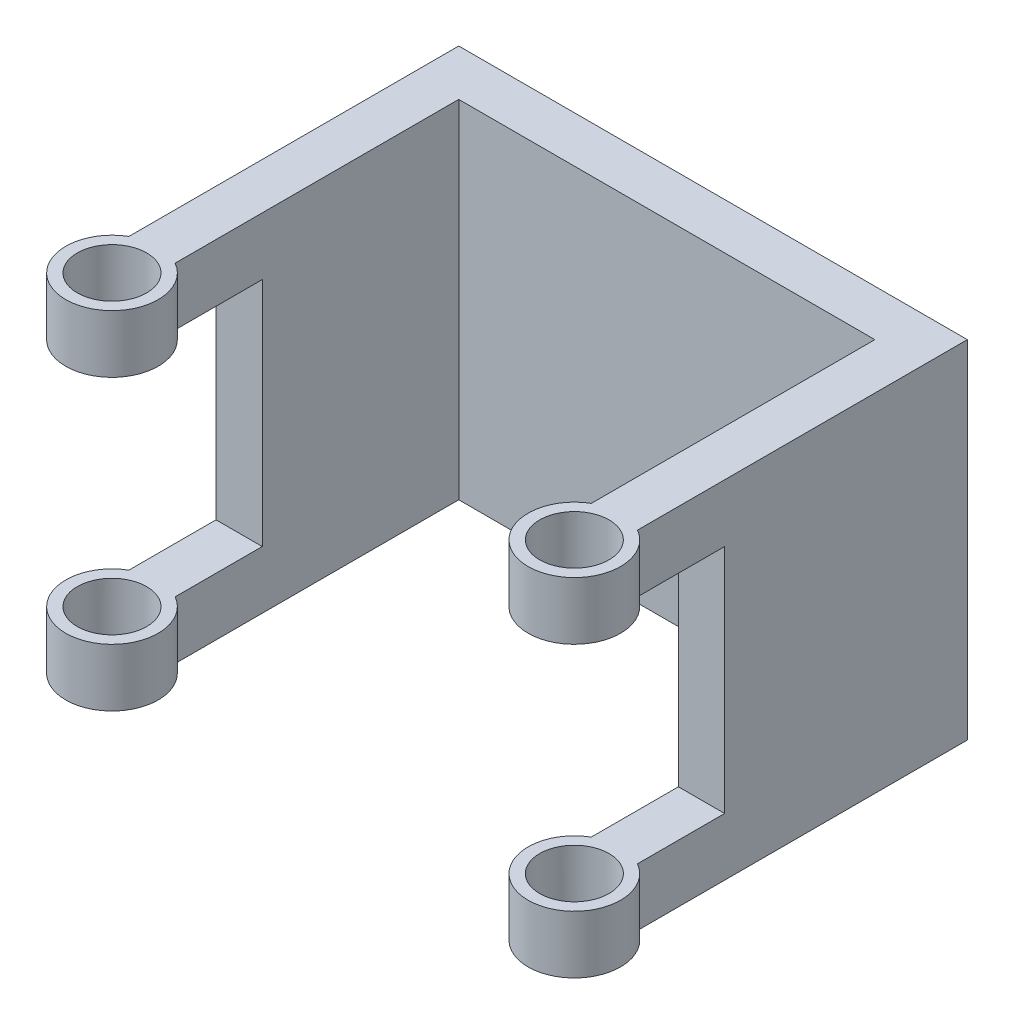
ISO-10303-21;
HEADER;
FILE_DESCRIPTION(('STEP AP214'),'2;1');
FILE_NAME('part.step','',(''),(''),'','','');
FILE_SCHEMA(('AUTOMOTIVE_DESIGN { 1 0 10303 214 1 1 1 1 }'));
ENDSEC;
DATA;
#1=APPLICATION_CONTEXT('core data for automotive mechanical design processes');
#2=APPLICATION_PROTOCOL_DEFINITION('international standard','automotive_design',2000,#1);
#3=PRODUCT_CONTEXT('',#1,'mechanical');
#4=PRODUCT('Part','Part','',(#3));
#5=PRODUCT_RELATED_PRODUCT_CATEGORY('part','',(#4));
#6=PRODUCT_DEFINITION_FORMATION('','',#4);
#7=PRODUCT_DEFINITION_CONTEXT('part definition',#1,'design');
#8=PRODUCT_DEFINITION('design','',#6,#7);
#9=PRODUCT_DEFINITION_SHAPE('','',#8);
#10=(LENGTH_UNIT() NAMED_UNIT(*) SI_UNIT(.MILLI.,.METRE.));
#11=(NAMED_UNIT(*) PLANE_ANGLE_UNIT() SI_UNIT($,.RADIAN.));
#12=(NAMED_UNIT(*) SI_UNIT($,.STERADIAN.) SOLID_ANGLE_UNIT());
#13=UNCERTAINTY_MEASURE_WITH_UNIT(LENGTH_MEASURE(1.E-05),#10,'distance_accuracy_value','');
#14=(GEOMETRIC_REPRESENTATION_CONTEXT(3) GLOBAL_UNCERTAINTY_ASSIGNED_CONTEXT((#13)) GLOBAL_UNIT_ASSIGNED_CONTEXT((#10,
#11,#12)) REPRESENTATION_CONTEXT('',''));
#15=CARTESIAN_POINT('',(0.,0.,0.));
#16=DIRECTION('',(0.,0.,1.));
#17=DIRECTION('',(1.,0.,0.));
#18=AXIS2_PLACEMENT_3D('',#15,#16,#17);
#19=CARTESIAN_POINT('',(20.,15.,0.));
#20=DIRECTION('',(0.,-1.,0.));
#21=DIRECTION('',(0.,0.,-1.));
#22=AXIS2_PLACEMENT_3D('',#19,#20,#21);
#23=CYLINDRICAL_SURFACE('',#22,2.);
#24=DIRECTION('',(0.,-1.,0.));
#25=VECTOR('',#24,1.);
#26=CARTESIAN_POINT('',(21.,15.,-1.73205080756888));
#27=LINE('',#26,#25);
#28=CARTESIAN_POINT('',(21.,2.5,-1.73205080756888));
#29=VERTEX_POINT('',#28);
#30=CARTESIAN_POINT('',(21.,0.,-1.73205080756888));
#31=VERTEX_POINT('',#30);
#32=EDGE_CURVE('E271',#29,#31,#27,.T.);
#33=ORIENTED_EDGE('',*,*,#32,.F.);
#34=CARTESIAN_POINT('',(20.,2.5,0.));
#35=DIRECTION('',(0.,-1.,0.));
#36=DIRECTION('',(0.,0.,-1.));
#37=AXIS2_PLACEMENT_3D('',#34,#35,#36);
#38=CIRCLE('',#37,2.);
#39=CARTESIAN_POINT('',(19.,2.5,-1.73205080756888));
#40=VERTEX_POINT('',#39);
#41=EDGE_CURVE('E189',#29,#40,#38,.T.);
#42=ORIENTED_EDGE('',*,*,#41,.T.);
#43=DIRECTION('',(0.,-1.,0.));
#44=VECTOR('',#43,1.);
#45=CARTESIAN_POINT('',(19.,15.,-1.73205080756888));
#46=LINE('',#45,#44);
#47=CARTESIAN_POINT('',(19.,0.,-1.73205080756888));
#48=VERTEX_POINT('',#47);
#49=EDGE_CURVE('E276',#40,#48,#46,.T.);
#50=ORIENTED_EDGE('',*,*,#49,.T.);
#51=CARTESIAN_POINT('',(20.,0.,0.));
#52=DIRECTION('',(0.,1.,0.));
#53=DIRECTION('',(0.,0.,1.));
#54=AXIS2_PLACEMENT_3D('',#51,#52,#53);
#55=CIRCLE('',#54,2.);
#56=EDGE_CURVE('E231',#48,#31,#55,.T.);
#57=ORIENTED_EDGE('',*,*,#56,.T.);
#58=EDGE_LOOP('',(#33,#42,#50,#57));
#59=FACE_BOUND('',#58,.T.);
#60=ADVANCED_FACE('F39',(#59),#23,.T.);
#61=CARTESIAN_POINT('',(0.,15.,0.));
#62=DIRECTION('',(0.,-1.,0.));
#63=DIRECTION('',(0.,0.,-1.));
#64=AXIS2_PLACEMENT_3D('',#61,#62,#63);
#65=CYLINDRICAL_SURFACE('',#64,2.);
#66=DIRECTION('',(0.,-1.,0.));
#67=VECTOR('',#66,1.);
#68=CARTESIAN_POINT('',(-0.999999999999999,15.,-1.73205080756888));
#69=LINE('',#68,#67);
#70=CARTESIAN_POINT('',(-0.999999999999999,15.,-1.73205080756888));
#71=VERTEX_POINT('',#70);
#72=CARTESIAN_POINT('',(-0.999999999999999,12.5,-1.73205080756888));
#73=VERTEX_POINT('',#72);
#74=EDGE_CURVE('E260',#71,#73,#69,.T.);
#75=ORIENTED_EDGE('',*,*,#74,.T.);
#76=CARTESIAN_POINT('',(0.,12.5,0.));
#77=DIRECTION('',(0.,1.,0.));
#78=DIRECTION('',(0.,0.,1.));
#79=AXIS2_PLACEMENT_3D('',#76,#77,#78);
#80=CIRCLE('',#79,2.);
#81=CARTESIAN_POINT('',(1.,12.5,-1.73205080756888));
#82=VERTEX_POINT('',#81);
#83=EDGE_CURVE('E157',#73,#82,#80,.T.);
#84=ORIENTED_EDGE('',*,*,#83,.T.);
#85=DIRECTION('',(0.,-1.,0.));
#86=VECTOR('',#85,1.);
#87=CARTESIAN_POINT('',(1.,15.,-1.73205080756888));
#88=LINE('',#87,#86);
#89=CARTESIAN_POINT('',(1.,15.,-1.73205080756888));
#90=VERTEX_POINT('',#89);
#91=EDGE_CURVE('E255',#90,#82,#88,.T.);
#92=ORIENTED_EDGE('',*,*,#91,.F.);
#93=CARTESIAN_POINT('',(0.,15.,0.));
#94=DIRECTION('',(0.,1.,0.));
#95=DIRECTION('',(0.,0.,1.));
#96=AXIS2_PLACEMENT_3D('',#93,#94,#95);
#97=CIRCLE('',#96,2.);
#98=EDGE_CURVE('E217',#71,#90,#97,.T.);
#99=ORIENTED_EDGE('',*,*,#98,.F.);
#100=EDGE_LOOP('',(#75,#84,#92,#99));
#101=FACE_BOUND('',#100,.T.);
#102=ADVANCED_FACE('F382',(#101),#65,.T.);
#103=CARTESIAN_POINT('',(1.,15.,-14.));
#104=DIRECTION('',(0.,0.,-1.));
#105=DIRECTION('',(-1.,0.,0.));
#106=AXIS2_PLACEMENT_3D('',#103,#104,#105);
#107=PLANE('',#106);
#108=DIRECTION('',(1.,0.,0.));
#109=VECTOR('',#108,1.);
#110=CARTESIAN_POINT('',(1.,0.,-14.));
#111=LINE('',#110,#109);
#112=CARTESIAN_POINT('',(1.,0.,-14.));
#113=VERTEX_POINT('',#112);
#114=CARTESIAN_POINT('',(19.,0.,-14.));
#115=VERTEX_POINT('',#114);
#116=EDGE_CURVE('E196',#113,#115,#111,.T.);
#117=ORIENTED_EDGE('',*,*,#116,.T.);
#118=DIRECTION('',(0.,-1.,0.));
#119=VECTOR('',#118,1.);
#120=CARTESIAN_POINT('',(19.,15.,-14.));
#121=LINE('',#120,#119);
#122=CARTESIAN_POINT('',(19.,15.,-14.));
#123=VERTEX_POINT('',#122);
#124=EDGE_CURVE('E281',#123,#115,#121,.T.);
#125=ORIENTED_EDGE('',*,*,#124,.F.);
#126=DIRECTION('',(1.,0.,0.));
#127=VECTOR('',#126,1.);
#128=CARTESIAN_POINT('',(1.,15.,-14.));
#129=LINE('',#128,#127);
#130=CARTESIAN_POINT('',(1.,15.,-14.));
#131=VERTEX_POINT('',#130);
#132=EDGE_CURVE('E197',#131,#123,#129,.T.);
#133=ORIENTED_EDGE('',*,*,#132,.F.);
#134=DIRECTION('',(0.,-1.,0.));
#135=VECTOR('',#134,1.);
#136=CARTESIAN_POINT('',(1.,15.,-14.));
#137=LINE('',#136,#135);
#138=EDGE_CURVE('E223',#131,#113,#137,.T.);
#139=ORIENTED_EDGE('',*,*,#138,.T.);
#140=EDGE_LOOP('',(#117,#125,#133,#139));
#141=FACE_BOUND('',#140,.T.);
#142=ADVANCED_FACE('F41',(#141),#107,.F.);
#143=CARTESIAN_POINT('',(19.,15.,-14.));
#144=DIRECTION('',(1.,0.,0.));
#145=DIRECTION('',(0.,0.,-1.));
#146=AXIS2_PLACEMENT_3D('',#143,#144,#145);
#147=PLANE('',#146);
#148=ORIENTED_EDGE('',*,*,#49,.F.);
#149=DIRECTION('',(0.,0.,-1.));
#150=VECTOR('',#149,1.);
#151=CARTESIAN_POINT('',(19.,2.5,-14.));
#152=LINE('',#151,#150);
#153=CARTESIAN_POINT('',(19.,2.5,-5.5));
#154=VERTEX_POINT('',#153);
#155=EDGE_CURVE('E181',#40,#154,#152,.T.);
#156=ORIENTED_EDGE('',*,*,#155,.T.);
#157=DIRECTION('',(0.,1.,0.));
#158=VECTOR('',#157,1.);
#159=CARTESIAN_POINT('',(19.,15.,-5.5));
#160=LINE('',#159,#158);
#161=CARTESIAN_POINT('',(19.,12.5,-5.5));
#162=VERTEX_POINT('',#161);
#163=EDGE_CURVE('E186',#154,#162,#160,.T.);
#164=ORIENTED_EDGE('',*,*,#163,.T.);
#165=DIRECTION('',(0.,0.,1.));
#166=VECTOR('',#165,1.);
#167=CARTESIAN_POINT('',(19.,12.5,-14.));
#168=LINE('',#167,#166);
#169=CARTESIAN_POINT('',(19.,12.5,-1.73205080756888));
#170=VERTEX_POINT('',#169);
#171=EDGE_CURVE('E334',#162,#170,#168,.T.);
#172=ORIENTED_EDGE('',*,*,#171,.T.);
#173=CARTESIAN_POINT('',(19.,15.,-1.73205080756888));
#174=VERTEX_POINT('',#173);
#175=EDGE_CURVE('E277',#174,#170,#46,.T.);
#176=ORIENTED_EDGE('',*,*,#175,.F.);
#177=DIRECTION('',(0.,0.,1.));
#178=VECTOR('',#177,1.);
#179=CARTESIAN_POINT('',(19.,15.,-14.));
#180=LINE('',#179,#178);
#181=EDGE_CURVE('E201',#123,#174,#180,.T.);
#182=ORIENTED_EDGE('',*,*,#181,.F.);
#183=ORIENTED_EDGE('',*,*,#124,.T.);
#184=DIRECTION('',(0.,0.,1.));
#185=VECTOR('',#184,1.);
#186=CARTESIAN_POINT('',(19.,0.,-14.));
#187=LINE('',#186,#185);
#188=EDGE_CURVE('E227',#115,#48,#187,.T.);
#189=ORIENTED_EDGE('',*,*,#188,.T.);
#190=EDGE_LOOP('',(#148,#156,#164,#172,#176,#182,#183,#189));
#191=FACE_BOUND('',#190,.T.);
#192=ADVANCED_FACE('F354',(#191),#147,.F.);
#193=CARTESIAN_POINT('',(20.,12.5,0.));
#194=DIRECTION('',(0.,1.,0.));
#195=DIRECTION('',(0.,0.,1.));
#196=AXIS2_PLACEMENT_3D('',#193,#194,#195);
#197=CIRCLE('',#196,2.);
#198=CARTESIAN_POINT('',(21.,12.5,-1.73205080756888));
#199=VERTEX_POINT('',#198);
#200=EDGE_CURVE('E331',#170,#199,#197,.T.);
#201=ORIENTED_EDGE('',*,*,#200,.T.);
#202=CARTESIAN_POINT('',(21.,15.,-1.73205080756888));
#203=VERTEX_POINT('',#202);
#204=EDGE_CURVE('E272',#203,#199,#27,.T.);
#205=ORIENTED_EDGE('',*,*,#204,.F.);
#206=CARTESIAN_POINT('',(20.,15.,0.));
#207=DIRECTION('',(0.,1.,0.));
#208=DIRECTION('',(0.,0.,1.));
#209=AXIS2_PLACEMENT_3D('',#206,#207,#208);
#210=CIRCLE('',#209,2.);
#211=EDGE_CURVE('E205',#174,#203,#210,.T.);
#212=ORIENTED_EDGE('',*,*,#211,.F.);
#213=ORIENTED_EDGE('',*,*,#175,.T.);
#214=EDGE_LOOP('',(#201,#205,#212,#213));
#215=FACE_BOUND('',#214,.T.);
#216=ADVANCED_FACE('F400',(#215),#23,.T.);
#217=CARTESIAN_POINT('',(21.,15.,-16.));
#218=DIRECTION('',(-1.,0.,0.));
#219=DIRECTION('',(0.,0.,1.));
#220=AXIS2_PLACEMENT_3D('',#217,#218,#219);
#221=PLANE('',#220);
#222=DIRECTION('',(0.,-1.,0.));
#223=VECTOR('',#222,1.);
#224=CARTESIAN_POINT('',(21.,15.,-5.5));
#225=LINE('',#224,#223);
#226=CARTESIAN_POINT('',(21.,12.5,-5.5));
#227=VERTEX_POINT('',#226);
#228=CARTESIAN_POINT('',(21.,2.5,-5.5));
#229=VERTEX_POINT('',#228);
#230=EDGE_CURVE('E180',#227,#229,#225,.T.);
#231=ORIENTED_EDGE('',*,*,#230,.T.);
#232=DIRECTION('',(0.,0.,1.));
#233=VECTOR('',#232,1.);
#234=CARTESIAN_POINT('',(21.,2.5,-16.));
#235=LINE('',#234,#233);
#236=EDGE_CURVE('E344',#229,#29,#235,.T.);
#237=ORIENTED_EDGE('',*,*,#236,.T.);
#238=ORIENTED_EDGE('',*,*,#32,.T.);
#239=DIRECTION('',(0.,0.,-1.));
#240=VECTOR('',#239,1.);
#241=CARTESIAN_POINT('',(21.,0.,-16.));
#242=LINE('',#241,#240);
#243=CARTESIAN_POINT('',(21.,0.,-16.));
#244=VERTEX_POINT('',#243);
#245=EDGE_CURVE('E235',#31,#244,#242,.T.);
#246=ORIENTED_EDGE('',*,*,#245,.T.);
#247=DIRECTION('',(0.,-1.,0.));
#248=VECTOR('',#247,1.);
#249=CARTESIAN_POINT('',(21.,15.,-16.));
#250=LINE('',#249,#248);
#251=CARTESIAN_POINT('',(21.,15.,-16.));
#252=VERTEX_POINT('',#251);
#253=EDGE_CURVE('E267',#252,#244,#250,.T.);
#254=ORIENTED_EDGE('',*,*,#253,.F.);
#255=DIRECTION('',(0.,0.,-1.));
#256=VECTOR('',#255,1.);
#257=CARTESIAN_POINT('',(21.,15.,-16.));
#258=LINE('',#257,#256);
#259=EDGE_CURVE('E208',#203,#252,#258,.T.);
#260=ORIENTED_EDGE('',*,*,#259,.F.);
#261=ORIENTED_EDGE('',*,*,#204,.T.);
#262=DIRECTION('',(0.,0.,-1.));
#263=VECTOR('',#262,1.);
#264=CARTESIAN_POINT('',(21.,12.5,-16.));
#265=LINE('',#264,#263);
#266=EDGE_CURVE('E163',#199,#227,#265,.T.);
#267=ORIENTED_EDGE('',*,*,#266,.T.);
#268=EDGE_LOOP('',(#231,#237,#238,#246,#254,#260,#261,#267));
#269=FACE_BOUND('',#268,.T.);
#270=ADVANCED_FACE('F392',(#269),#221,.F.);
#271=CARTESIAN_POINT('',(-1.,15.,-16.));
#272=DIRECTION('',(0.,0.,1.));
#273=DIRECTION('',(1.,0.,0.));
#274=AXIS2_PLACEMENT_3D('',#271,#272,#273);
#275=PLANE('',#274);
#276=DIRECTION('',(-1.,0.,0.));
#277=VECTOR('',#276,1.);
#278=CARTESIAN_POINT('',(-1.,0.,-16.));
#279=LINE('',#278,#277);
#280=CARTESIAN_POINT('',(-1.,0.,-16.));
#281=VERTEX_POINT('',#280);
#282=EDGE_CURVE('E238',#244,#281,#279,.T.);
#283=ORIENTED_EDGE('',*,*,#282,.T.);
#284=DIRECTION('',(0.,-1.,0.));
#285=VECTOR('',#284,1.);
#286=CARTESIAN_POINT('',(-1.,15.,-16.));
#287=LINE('',#286,#285);
#288=CARTESIAN_POINT('',(-1.,15.,-16.));
#289=VERTEX_POINT('',#288);
#290=EDGE_CURVE('E263',#289,#281,#287,.T.);
#291=ORIENTED_EDGE('',*,*,#290,.F.);
#292=DIRECTION('',(-1.,0.,0.));
#293=VECTOR('',#292,1.);
#294=CARTESIAN_POINT('',(-1.,15.,-16.));
#295=LINE('',#294,#293);
#296=EDGE_CURVE('E211',#252,#289,#295,.T.);
#297=ORIENTED_EDGE('',*,*,#296,.F.);
#298=ORIENTED_EDGE('',*,*,#253,.T.);
#299=EDGE_LOOP('',(#283,#291,#297,#298));
#300=FACE_BOUND('',#299,.T.);
#301=ADVANCED_FACE('F388',(#300),#275,.F.);
#302=CARTESIAN_POINT('',(-1.,15.,-1.73205080756888));
#303=DIRECTION('',(1.,0.,0.));
#304=DIRECTION('',(0.,0.,-1.));
#305=AXIS2_PLACEMENT_3D('',#302,#303,#304);
#306=PLANE('',#305);
#307=CARTESIAN_POINT('',(-0.999999999999999,2.5,-1.73205080756888));
#308=VERTEX_POINT('',#307);
#309=CARTESIAN_POINT('',(-0.999999999999999,0.,-1.73205080756888));
#310=VERTEX_POINT('',#309);
#311=EDGE_CURVE('E259',#308,#310,#69,.T.);
#312=ORIENTED_EDGE('',*,*,#311,.F.);
#313=DIRECTION('',(0.,0.,-1.));
#314=VECTOR('',#313,1.);
#315=CARTESIAN_POINT('',(-1.,2.5,-1.73205080756888));
#316=LINE('',#315,#314);
#317=CARTESIAN_POINT('',(-1.,2.5,-5.5));
#318=VERTEX_POINT('',#317);
#319=EDGE_CURVE('E178',#308,#318,#316,.T.);
#320=ORIENTED_EDGE('',*,*,#319,.T.);
#321=DIRECTION('',(0.,1.,0.));
#322=VECTOR('',#321,1.);
#323=CARTESIAN_POINT('',(-1.,15.,-5.5));
#324=LINE('',#323,#322);
#325=CARTESIAN_POINT('',(-1.,12.5,-5.5));
#326=VERTEX_POINT('',#325);
#327=EDGE_CURVE('E168',#318,#326,#324,.T.);
#328=ORIENTED_EDGE('',*,*,#327,.T.);
#329=DIRECTION('',(0.,0.,1.));
#330=VECTOR('',#329,1.);
#331=CARTESIAN_POINT('',(-1.,12.5,-1.73205080756888));
#332=LINE('',#331,#330);
#333=EDGE_CURVE('E155',#326,#73,#332,.T.);
#334=ORIENTED_EDGE('',*,*,#333,.T.);
#335=ORIENTED_EDGE('',*,*,#74,.F.);
#336=DIRECTION('',(0.,0.,1.));
#337=VECTOR('',#336,1.);
#338=CARTESIAN_POINT('',(-1.,15.,-1.73205080756888));
#339=LINE('',#338,#337);
#340=EDGE_CURVE('E214',#289,#71,#339,.T.);
#341=ORIENTED_EDGE('',*,*,#340,.F.);
#342=ORIENTED_EDGE('',*,*,#290,.T.);
#343=DIRECTION('',(0.,0.,1.));
#344=VECTOR('',#343,1.);
#345=CARTESIAN_POINT('',(-1.,0.,-1.73205080756888));
#346=LINE('',#345,#344);
#347=EDGE_CURVE('E241',#281,#310,#346,.T.);
#348=ORIENTED_EDGE('',*,*,#347,.T.);
#349=EDGE_LOOP('',(#312,#320,#328,#334,#335,#341,#342,#348));
#350=FACE_BOUND('',#349,.T.);
#351=ADVANCED_FACE('F177',(#350),#306,.F.);
#352=CARTESIAN_POINT('',(1.,2.5,-1.73205080756888));
#353=VERTEX_POINT('',#352);
#354=CARTESIAN_POINT('',(1.,0.,-1.73205080756888));
#355=VERTEX_POINT('',#354);
#356=EDGE_CURVE('E254',#353,#355,#88,.T.);
#357=ORIENTED_EDGE('',*,*,#356,.F.);
#358=CARTESIAN_POINT('',(0.,2.5,0.));
#359=DIRECTION('',(0.,-1.,0.));
#360=DIRECTION('',(0.,0.,-1.));
#361=AXIS2_PLACEMENT_3D('',#358,#359,#360);
#362=CIRCLE('',#361,2.);
#363=EDGE_CURVE('E338',#353,#308,#362,.T.);
#364=ORIENTED_EDGE('',*,*,#363,.T.);
#365=ORIENTED_EDGE('',*,*,#311,.T.);
#366=CARTESIAN_POINT('',(0.,0.,0.));
#367=DIRECTION('',(0.,1.,0.));
#368=DIRECTION('',(0.,0.,1.));
#369=AXIS2_PLACEMENT_3D('',#366,#367,#368);
#370=CIRCLE('',#369,2.);
#371=EDGE_CURVE('E245',#310,#355,#370,.T.);
#372=ORIENTED_EDGE('',*,*,#371,.T.);
#373=EDGE_LOOP('',(#357,#364,#365,#372));
#374=FACE_BOUND('',#373,.T.);
#375=ADVANCED_FACE('F367',(#374),#65,.T.);
#376=CARTESIAN_POINT('',(1.,15.,-1.73205080756888));
#377=DIRECTION('',(-1.,0.,0.));
#378=DIRECTION('',(0.,0.,1.));
#379=AXIS2_PLACEMENT_3D('',#376,#377,#378);
#380=PLANE('',#379);
#381=DIRECTION('',(0.,-1.,0.));
#382=VECTOR('',#381,1.);
#383=CARTESIAN_POINT('',(1.,15.,-5.5));
#384=LINE('',#383,#382);
#385=CARTESIAN_POINT('',(1.,12.5,-5.5));
#386=VERTEX_POINT('',#385);
#387=CARTESIAN_POINT('',(1.,2.5,-5.5));
#388=VERTEX_POINT('',#387);
#389=EDGE_CURVE('E49',#386,#388,#384,.T.);
#390=ORIENTED_EDGE('',*,*,#389,.T.);
#391=DIRECTION('',(0.,0.,1.));
#392=VECTOR('',#391,1.);
#393=CARTESIAN_POINT('',(1.,2.5,-1.73205080756888));
#394=LINE('',#393,#392);
#395=EDGE_CURVE('E11',#388,#353,#394,.T.);
#396=ORIENTED_EDGE('',*,*,#395,.T.);
#397=ORIENTED_EDGE('',*,*,#356,.T.);
#398=DIRECTION('',(0.,0.,-1.));
#399=VECTOR('',#398,1.);
#400=CARTESIAN_POINT('',(1.,0.,-1.73205080756888));
#401=LINE('',#400,#399);
#402=EDGE_CURVE('E202',#355,#113,#401,.T.);
#403=ORIENTED_EDGE('',*,*,#402,.T.);
#404=ORIENTED_EDGE('',*,*,#138,.F.);
#405=DIRECTION('',(0.,0.,-1.));
#406=VECTOR('',#405,1.);
#407=CARTESIAN_POINT('',(1.,15.,-1.73205080756888));
#408=LINE('',#407,#406);
#409=EDGE_CURVE('E220',#90,#131,#408,.T.);
#410=ORIENTED_EDGE('',*,*,#409,.F.);
#411=ORIENTED_EDGE('',*,*,#91,.T.);
#412=DIRECTION('',(0.,0.,-1.));
#413=VECTOR('',#412,1.);
#414=CARTESIAN_POINT('',(1.,12.5,-1.73205080756888));
#415=LINE('',#414,#413);
#416=EDGE_CURVE('E285',#82,#386,#415,.T.);
#417=ORIENTED_EDGE('',*,*,#416,.T.);
#418=EDGE_LOOP('',(#390,#396,#397,#403,#404,#410,#411,#417));
#419=FACE_BOUND('',#418,.T.);
#420=ADVANCED_FACE('F362',(#419),#380,.F.);
#421=CARTESIAN_POINT('',(20.,15.,0.));
#422=DIRECTION('',(0.,1.,0.));
#423=DIRECTION('',(0.,0.,1.));
#424=AXIS2_PLACEMENT_3D('',#421,#422,#423);
#425=PLANE('',#424);
#426=CARTESIAN_POINT('',(0.,15.,0.));
#427=DIRECTION('',(0.,1.,0.));
#428=DIRECTION('',(0.,0.,1.));
#429=AXIS2_PLACEMENT_3D('',#426,#427,#428);
#430=CIRCLE('',#429,1.5);
#431=CARTESIAN_POINT('',(0.,15.,1.5));
#432=VERTEX_POINT('',#431);
#433=EDGE_CURVE('E301',#432,#432,#430,.T.);
#434=ORIENTED_EDGE('',*,*,#433,.F.);
#435=EDGE_LOOP('',(#434));
#436=FACE_BOUND('',#435,.T.);
#437=CARTESIAN_POINT('',(20.,15.,0.));
#438=DIRECTION('',(0.,1.,0.));
#439=DIRECTION('',(0.,0.,1.));
#440=AXIS2_PLACEMENT_3D('',#437,#438,#439);
#441=CIRCLE('',#440,1.5);
#442=CARTESIAN_POINT('',(20.,15.,1.5));
#443=VERTEX_POINT('',#442);
#444=EDGE_CURVE('E313',#443,#443,#441,.T.);
#445=ORIENTED_EDGE('',*,*,#444,.F.);
#446=EDGE_LOOP('',(#445));
#447=FACE_BOUND('',#446,.T.);
#448=ORIENTED_EDGE('',*,*,#132,.T.);
#449=ORIENTED_EDGE('',*,*,#181,.T.);
#450=ORIENTED_EDGE('',*,*,#211,.T.);
#451=ORIENTED_EDGE('',*,*,#259,.T.);
#452=ORIENTED_EDGE('',*,*,#296,.T.);
#453=ORIENTED_EDGE('',*,*,#340,.T.);
#454=ORIENTED_EDGE('',*,*,#98,.T.);
#455=ORIENTED_EDGE('',*,*,#409,.T.);
#456=EDGE_LOOP('',(#448,#449,#450,#451,#452,#453,#454,#455));
#457=FACE_BOUND('',#456,.T.);
#458=ADVANCED_FACE('F378',(#436,#447,#457),#425,.T.);
#459=CARTESIAN_POINT('',(20.,0.,0.));
#460=DIRECTION('',(0.,1.,0.));
#461=DIRECTION('',(0.,0.,1.));
#462=AXIS2_PLACEMENT_3D('',#459,#460,#461);
#463=PLANE('',#462);
#464=CARTESIAN_POINT('',(0.,0.,0.));
#465=DIRECTION('',(0.,1.,0.));
#466=DIRECTION('',(0.,0.,1.));
#467=AXIS2_PLACEMENT_3D('',#464,#465,#466);
#468=CIRCLE('',#467,1.5);
#469=CARTESIAN_POINT('',(0.,0.,1.5));
#470=VERTEX_POINT('',#469);
#471=EDGE_CURVE('E293',#470,#470,#468,.T.);
#472=ORIENTED_EDGE('',*,*,#471,.T.);
#473=EDGE_LOOP('',(#472));
#474=FACE_BOUND('',#473,.T.);
#475=CARTESIAN_POINT('',(20.,0.,0.));
#476=DIRECTION('',(0.,1.,0.));
#477=DIRECTION('',(0.,0.,1.));
#478=AXIS2_PLACEMENT_3D('',#475,#476,#477);
#479=CIRCLE('',#478,1.5);
#480=CARTESIAN_POINT('',(20.,0.,1.5));
#481=VERTEX_POINT('',#480);
#482=EDGE_CURVE('E307',#481,#481,#479,.T.);
#483=ORIENTED_EDGE('',*,*,#482,.T.);
#484=EDGE_LOOP('',(#483));
#485=FACE_BOUND('',#484,.T.);
#486=ORIENTED_EDGE('',*,*,#116,.F.);
#487=ORIENTED_EDGE('',*,*,#402,.F.);
#488=ORIENTED_EDGE('',*,*,#371,.F.);
#489=ORIENTED_EDGE('',*,*,#347,.F.);
#490=ORIENTED_EDGE('',*,*,#282,.F.);
#491=ORIENTED_EDGE('',*,*,#245,.F.);
#492=ORIENTED_EDGE('',*,*,#56,.F.);
#493=ORIENTED_EDGE('',*,*,#188,.F.);
#494=EDGE_LOOP('',(#486,#487,#488,#489,#490,#491,#492,#493));
#495=FACE_BOUND('',#494,.T.);
#496=ADVANCED_FACE('F371',(#474,#485,#495),#463,.F.);
#497=CARTESIAN_POINT('',(-2.,12.5,-5.5));
#498=DIRECTION('',(0.,1.,0.));
#499=DIRECTION('',(0.,0.,1.));
#500=AXIS2_PLACEMENT_3D('',#497,#498,#499);
#501=PLANE('',#500);
#502=CARTESIAN_POINT('',(0.,12.5,0.));
#503=DIRECTION('',(0.,1.,0.));
#504=DIRECTION('',(0.,0.,1.));
#505=AXIS2_PLACEMENT_3D('',#502,#503,#504);
#506=CIRCLE('',#505,1.5);
#507=CARTESIAN_POINT('',(0.,12.5,1.5));
#508=VERTEX_POINT('',#507);
#509=EDGE_CURVE('E317',#508,#508,#506,.T.);
#510=ORIENTED_EDGE('',*,*,#509,.T.);
#511=EDGE_LOOP('',(#510));
#512=FACE_BOUND('',#511,.T.);
#513=DIRECTION('',(1.,0.,0.));
#514=VECTOR('',#513,1.);
#515=CARTESIAN_POINT('',(-2.,12.5,-5.5));
#516=LINE('',#515,#514);
#517=EDGE_CURVE('E65',#326,#386,#516,.T.);
#518=ORIENTED_EDGE('',*,*,#517,.T.);
#519=ORIENTED_EDGE('',*,*,#416,.F.);
#520=ORIENTED_EDGE('',*,*,#83,.F.);
#521=ORIENTED_EDGE('',*,*,#333,.F.);
#522=EDGE_LOOP('',(#518,#519,#520,#521));
#523=FACE_BOUND('',#522,.T.);
#524=ADVANCED_FACE('F156',(#512,#523),#501,.F.);
#525=CARTESIAN_POINT('',(-2.,2.5,-5.5));
#526=DIRECTION('',(0.,-1.,0.));
#527=DIRECTION('',(0.,0.,-1.));
#528=AXIS2_PLACEMENT_3D('',#525,#526,#527);
#529=PLANE('',#528);
#530=CARTESIAN_POINT('',(0.,2.5,0.));
#531=DIRECTION('',(0.,-1.,0.));
#532=DIRECTION('',(0.,0.,-1.));
#533=AXIS2_PLACEMENT_3D('',#530,#531,#532);
#534=CIRCLE('',#533,1.5);
#535=CARTESIAN_POINT('',(0.,2.5,-1.5));
#536=VERTEX_POINT('',#535);
#537=EDGE_CURVE('E43',#536,#536,#534,.T.);
#538=ORIENTED_EDGE('',*,*,#537,.T.);
#539=EDGE_LOOP('',(#538));
#540=FACE_BOUND('',#539,.T.);
#541=ORIENTED_EDGE('',*,*,#363,.F.);
#542=ORIENTED_EDGE('',*,*,#395,.F.);
#543=DIRECTION('',(1.,0.,0.));
#544=VECTOR('',#543,1.);
#545=CARTESIAN_POINT('',(-2.,2.5,-5.5));
#546=LINE('',#545,#544);
#547=EDGE_CURVE('E323',#318,#388,#546,.T.);
#548=ORIENTED_EDGE('',*,*,#547,.F.);
#549=ORIENTED_EDGE('',*,*,#319,.F.);
#550=EDGE_LOOP('',(#541,#542,#548,#549));
#551=FACE_BOUND('',#550,.T.);
#552=ADVANCED_FACE('F415',(#540,#551),#529,.F.);
#553=CARTESIAN_POINT('',(-2.,12.5,-5.5));
#554=DIRECTION('',(0.,0.,-1.));
#555=DIRECTION('',(-1.,0.,0.));
#556=AXIS2_PLACEMENT_3D('',#553,#554,#555);
#557=PLANE('',#556);
#558=ORIENTED_EDGE('',*,*,#547,.T.);
#559=ORIENTED_EDGE('',*,*,#389,.F.);
#560=ORIENTED_EDGE('',*,*,#517,.F.);
#561=ORIENTED_EDGE('',*,*,#327,.F.);
#562=EDGE_LOOP('',(#558,#559,#560,#561));
#563=FACE_BOUND('',#562,.T.);
#564=ADVANCED_FACE('F167',(#563),#557,.F.);
#565=EDGE_CURVE('E173',#154,#229,#546,.T.);
#566=ORIENTED_EDGE('',*,*,#565,.T.);
#567=ORIENTED_EDGE('',*,*,#230,.F.);
#568=EDGE_CURVE('E57',#162,#227,#516,.T.);
#569=ORIENTED_EDGE('',*,*,#568,.F.);
#570=ORIENTED_EDGE('',*,*,#163,.F.);
#571=EDGE_LOOP('',(#566,#567,#569,#570));
#572=FACE_BOUND('',#571,.T.);
#573=ADVANCED_FACE('F396',(#572),#557,.F.);
#574=CARTESIAN_POINT('',(20.,2.5,0.));
#575=DIRECTION('',(0.,-1.,0.));
#576=DIRECTION('',(0.,0.,-1.));
#577=AXIS2_PLACEMENT_3D('',#574,#575,#576);
#578=CIRCLE('',#577,1.5);
#579=CARTESIAN_POINT('',(20.,2.5,-1.5));
#580=VERTEX_POINT('',#579);
#581=EDGE_CURVE('E292',#580,#580,#578,.T.);
#582=ORIENTED_EDGE('',*,*,#581,.T.);
#583=EDGE_LOOP('',(#582));
#584=FACE_BOUND('',#583,.T.);
#585=ORIENTED_EDGE('',*,*,#41,.F.);
#586=ORIENTED_EDGE('',*,*,#236,.F.);
#587=ORIENTED_EDGE('',*,*,#565,.F.);
#588=ORIENTED_EDGE('',*,*,#155,.F.);
#589=EDGE_LOOP('',(#585,#586,#587,#588));
#590=FACE_BOUND('',#589,.T.);
#591=ADVANCED_FACE('F394',(#584,#590),#529,.F.);
#592=CARTESIAN_POINT('',(20.,12.5,0.));
#593=DIRECTION('',(0.,1.,0.));
#594=DIRECTION('',(0.,0.,1.));
#595=AXIS2_PLACEMENT_3D('',#592,#593,#594);
#596=CIRCLE('',#595,1.5);
#597=CARTESIAN_POINT('',(20.,12.5,1.5));
#598=VERTEX_POINT('',#597);
#599=EDGE_CURVE('E289',#598,#598,#596,.T.);
#600=ORIENTED_EDGE('',*,*,#599,.T.);
#601=EDGE_LOOP('',(#600));
#602=FACE_BOUND('',#601,.T.);
#603=ORIENTED_EDGE('',*,*,#568,.T.);
#604=ORIENTED_EDGE('',*,*,#266,.F.);
#605=ORIENTED_EDGE('',*,*,#200,.F.);
#606=ORIENTED_EDGE('',*,*,#171,.F.);
#607=EDGE_LOOP('',(#603,#604,#605,#606));
#608=FACE_BOUND('',#607,.T.);
#609=ADVANCED_FACE('F402',(#602,#608),#501,.F.);
#610=CARTESIAN_POINT('',(20.,0.,0.));
#611=DIRECTION('',(0.,1.,0.));
#612=DIRECTION('',(0.,0.,1.));
#613=AXIS2_PLACEMENT_3D('',#610,#611,#612);
#614=CYLINDRICAL_SURFACE('',#613,1.5);
#615=ORIENTED_EDGE('',*,*,#444,.T.);
#616=EDGE_LOOP('',(#615));
#617=FACE_BOUND('',#616,.T.);
#618=ORIENTED_EDGE('',*,*,#599,.F.);
#619=EDGE_LOOP('',(#618));
#620=FACE_BOUND('',#619,.T.);
#621=ADVANCED_FACE('F404',(#617,#620),#614,.F.);
#622=ORIENTED_EDGE('',*,*,#482,.F.);
#623=EDGE_LOOP('',(#622));
#624=FACE_BOUND('',#623,.T.);
#625=ORIENTED_EDGE('',*,*,#581,.F.);
#626=EDGE_LOOP('',(#625));
#627=FACE_BOUND('',#626,.T.);
#628=ADVANCED_FACE('F410',(#624,#627),#614,.F.);
#629=CARTESIAN_POINT('',(0.,0.,0.));
#630=DIRECTION('',(0.,1.,0.));
#631=DIRECTION('',(0.,0.,1.));
#632=AXIS2_PLACEMENT_3D('',#629,#630,#631);
#633=CYLINDRICAL_SURFACE('',#632,1.5);
#634=ORIENTED_EDGE('',*,*,#471,.F.);
#635=EDGE_LOOP('',(#634));
#636=FACE_BOUND('',#635,.T.);
#637=ORIENTED_EDGE('',*,*,#537,.F.);
#638=EDGE_LOOP('',(#637));
#639=FACE_BOUND('',#638,.T.);
#640=ADVANCED_FACE('F552',(#636,#639),#633,.F.);
#641=ORIENTED_EDGE('',*,*,#433,.T.);
#642=EDGE_LOOP('',(#641));
#643=FACE_BOUND('',#642,.T.);
#644=ORIENTED_EDGE('',*,*,#509,.F.);
#645=EDGE_LOOP('',(#644));
#646=FACE_BOUND('',#645,.T.);
#647=ADVANCED_FACE('F561',(#643,#646),#633,.F.);
#648=CLOSED_SHELL('',(#60,#102,#142,#192,#216,#270,#301,#351,#375,#420,#458,#496,#524,#552,#564,
#573,#591,#609,#621,#628,#640,#647));
#649=MANIFOLD_SOLID_BREP('B2',#648);
#650=ADVANCED_BREP_SHAPE_REPRESENTATION('',(#18,#649),#14);
#651=SHAPE_DEFINITION_REPRESENTATION(#9,#650);
ENDSEC;
END-ISO-10303-21;
